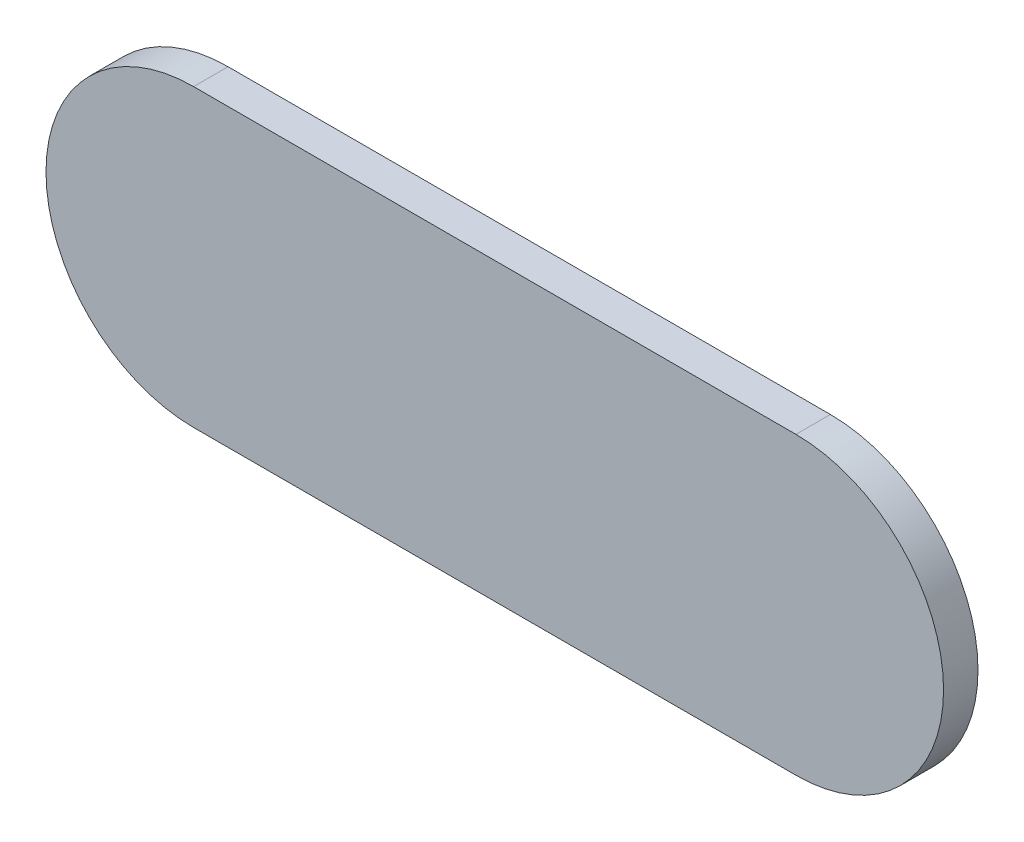
ISO-10303-21;
HEADER;
FILE_DESCRIPTION(('STEP AP214'),'2;1');
FILE_NAME('part.step','',(''),(''),'','','');
FILE_SCHEMA(('AUTOMOTIVE_DESIGN { 1 0 10303 214 1 1 1 1 }'));
ENDSEC;
DATA;
#1=APPLICATION_CONTEXT('core data for automotive mechanical design processes');
#2=APPLICATION_PROTOCOL_DEFINITION('international standard','automotive_design',2000,#1);
#3=PRODUCT_CONTEXT('',#1,'mechanical');
#4=PRODUCT('Part','Part','',(#3));
#5=PRODUCT_RELATED_PRODUCT_CATEGORY('part','',(#4));
#6=PRODUCT_DEFINITION_FORMATION('','',#4);
#7=PRODUCT_DEFINITION_CONTEXT('part definition',#1,'design');
#8=PRODUCT_DEFINITION('design','',#6,#7);
#9=PRODUCT_DEFINITION_SHAPE('','',#8);
#10=(LENGTH_UNIT() NAMED_UNIT(*) SI_UNIT(.MILLI.,.METRE.));
#11=(NAMED_UNIT(*) PLANE_ANGLE_UNIT() SI_UNIT($,.RADIAN.));
#12=(NAMED_UNIT(*) SI_UNIT($,.STERADIAN.) SOLID_ANGLE_UNIT());
#13=UNCERTAINTY_MEASURE_WITH_UNIT(LENGTH_MEASURE(1.E-05),#10,'distance_accuracy_value','');
#14=(GEOMETRIC_REPRESENTATION_CONTEXT(3) GLOBAL_UNCERTAINTY_ASSIGNED_CONTEXT((#13)) GLOBAL_UNIT_ASSIGNED_CONTEXT((#10,
#11,#12)) REPRESENTATION_CONTEXT('',''));
#15=CARTESIAN_POINT('',(0.,0.,0.));
#16=DIRECTION('',(0.,0.,1.));
#17=DIRECTION('',(1.,0.,0.));
#18=AXIS2_PLACEMENT_3D('',#15,#16,#17);
#19=CARTESIAN_POINT('',(120.055,-66.235,1.635));
#20=DIRECTION('',(0.,0.,1.));
#21=DIRECTION('',(1.,0.,0.));
#22=AXIS2_PLACEMENT_3D('',#19,#20,#21);
#23=PLANE('',#22);
#24=DIRECTION('',(-1.,0.,0.));
#25=VECTOR('',#24,1.);
#26=CARTESIAN_POINT('',(120.055,-66.235,1.635));
#27=LINE('',#26,#25);
#28=CARTESIAN_POINT('',(120.055,-66.235,1.635));
#29=VERTEX_POINT('',#28);
#30=CARTESIAN_POINT('',(119.443,-66.235,1.635));
#31=VERTEX_POINT('',#30);
#32=EDGE_CURVE('E81',#29,#31,#27,.T.);
#33=ORIENTED_EDGE('',*,*,#32,.T.);
#34=CARTESIAN_POINT('',(119.443,-66.385,1.635));
#35=DIRECTION('',(0.,0.,1.));
#36=DIRECTION('',(0.,1.,0.));
#37=AXIS2_PLACEMENT_3D('',#34,#35,#36);
#38=CIRCLE('',#37,0.15);
#39=CARTESIAN_POINT('',(119.443,-66.535,1.635));
#40=VERTEX_POINT('',#39);
#41=EDGE_CURVE('E99',#31,#40,#38,.T.);
#42=ORIENTED_EDGE('',*,*,#41,.T.);
#43=DIRECTION('',(1.,0.,0.));
#44=VECTOR('',#43,1.);
#45=CARTESIAN_POINT('',(119.443,-66.535,1.635));
#46=LINE('',#45,#44);
#47=CARTESIAN_POINT('',(120.055,-66.535,1.635));
#48=VERTEX_POINT('',#47);
#49=EDGE_CURVE('E74',#40,#48,#46,.T.);
#50=ORIENTED_EDGE('',*,*,#49,.T.);
#51=CARTESIAN_POINT('',(120.055,-66.385,1.635));
#52=DIRECTION('',(0.,0.,1.));
#53=DIRECTION('',(0.,-1.,0.));
#54=AXIS2_PLACEMENT_3D('',#51,#52,#53);
#55=CIRCLE('',#54,0.15);
#56=EDGE_CURVE('E11',#48,#29,#55,.T.);
#57=ORIENTED_EDGE('',*,*,#56,.T.);
#58=EDGE_LOOP('',(#33,#42,#50,#57));
#59=FACE_BOUND('',#58,.T.);
#60=ADVANCED_FACE('F17',(#59),#23,.T.);
#61=CARTESIAN_POINT('',(120.055,-66.235,1.6));
#62=DIRECTION('',(0.,0.,1.));
#63=DIRECTION('',(1.,0.,0.));
#64=AXIS2_PLACEMENT_3D('',#61,#62,#63);
#65=PLANE('',#64);
#66=CARTESIAN_POINT('',(120.055,-66.385,1.6));
#67=DIRECTION('',(0.,0.,1.));
#68=DIRECTION('',(0.,-1.,0.));
#69=AXIS2_PLACEMENT_3D('',#66,#67,#68);
#70=CIRCLE('',#69,0.15);
#71=CARTESIAN_POINT('',(120.055,-66.535,1.6));
#72=VERTEX_POINT('',#71);
#73=CARTESIAN_POINT('',(120.055,-66.235,1.6));
#74=VERTEX_POINT('',#73);
#75=EDGE_CURVE('E26',#72,#74,#70,.T.);
#76=ORIENTED_EDGE('',*,*,#75,.F.);
#77=DIRECTION('',(1.,0.,0.));
#78=VECTOR('',#77,1.);
#79=CARTESIAN_POINT('',(119.443,-66.535,1.6));
#80=LINE('',#79,#78);
#81=CARTESIAN_POINT('',(119.443,-66.535,1.6));
#82=VERTEX_POINT('',#81);
#83=EDGE_CURVE('E103',#82,#72,#80,.T.);
#84=ORIENTED_EDGE('',*,*,#83,.F.);
#85=CARTESIAN_POINT('',(119.443,-66.385,1.6));
#86=DIRECTION('',(0.,0.,1.));
#87=DIRECTION('',(0.,1.,0.));
#88=AXIS2_PLACEMENT_3D('',#85,#86,#87);
#89=CIRCLE('',#88,0.15);
#90=CARTESIAN_POINT('',(119.443,-66.235,1.6));
#91=VERTEX_POINT('',#90);
#92=EDGE_CURVE('E83',#91,#82,#89,.T.);
#93=ORIENTED_EDGE('',*,*,#92,.F.);
#94=DIRECTION('',(-1.,0.,0.));
#95=VECTOR('',#94,1.);
#96=CARTESIAN_POINT('',(120.055,-66.235,1.6));
#97=LINE('',#96,#95);
#98=EDGE_CURVE('E79',#74,#91,#97,.T.);
#99=ORIENTED_EDGE('',*,*,#98,.F.);
#100=EDGE_LOOP('',(#76,#84,#93,#99));
#101=FACE_BOUND('',#100,.T.);
#102=ADVANCED_FACE('F85',(#101),#65,.F.);
#103=CARTESIAN_POINT('',(120.055,-66.385,1.6));
#104=DIRECTION('',(0.,0.,-1.));
#105=DIRECTION('',(0.,-1.,0.));
#106=AXIS2_PLACEMENT_3D('',#103,#104,#105);
#107=CYLINDRICAL_SURFACE('',#106,0.15);
#108=ORIENTED_EDGE('',*,*,#75,.T.);
#109=DIRECTION('',(0.,0.,1.));
#110=VECTOR('',#109,1.);
#111=CARTESIAN_POINT('',(120.055,-66.235,1.6));
#112=LINE('',#111,#110);
#113=EDGE_CURVE('E68',#74,#29,#112,.T.);
#114=ORIENTED_EDGE('',*,*,#113,.T.);
#115=ORIENTED_EDGE('',*,*,#56,.F.);
#116=DIRECTION('',(0.,0.,1.));
#117=VECTOR('',#116,1.);
#118=CARTESIAN_POINT('',(120.055,-66.535,1.6));
#119=LINE('',#118,#117);
#120=EDGE_CURVE('E71',#72,#48,#119,.T.);
#121=ORIENTED_EDGE('',*,*,#120,.F.);
#122=EDGE_LOOP('',(#108,#114,#115,#121));
#123=FACE_BOUND('',#122,.T.);
#124=ADVANCED_FACE('F19',(#123),#107,.T.);
#125=CARTESIAN_POINT('',(119.443,-66.535,1.6));
#126=DIRECTION('',(0.,1.,0.));
#127=DIRECTION('',(1.,0.,0.));
#128=AXIS2_PLACEMENT_3D('',#125,#126,#127);
#129=PLANE('',#128);
#130=ORIENTED_EDGE('',*,*,#83,.T.);
#131=ORIENTED_EDGE('',*,*,#120,.T.);
#132=ORIENTED_EDGE('',*,*,#49,.F.);
#133=DIRECTION('',(0.,0.,1.));
#134=VECTOR('',#133,1.);
#135=CARTESIAN_POINT('',(119.443,-66.535,1.6));
#136=LINE('',#135,#134);
#137=EDGE_CURVE('E97',#82,#40,#136,.T.);
#138=ORIENTED_EDGE('',*,*,#137,.F.);
#139=EDGE_LOOP('',(#130,#131,#132,#138));
#140=FACE_BOUND('',#139,.T.);
#141=ADVANCED_FACE('F119',(#140),#129,.F.);
#142=CARTESIAN_POINT('',(119.443,-66.385,1.6));
#143=DIRECTION('',(0.,0.,-1.));
#144=DIRECTION('',(0.,1.,0.));
#145=AXIS2_PLACEMENT_3D('',#142,#143,#144);
#146=CYLINDRICAL_SURFACE('',#145,0.15);
#147=ORIENTED_EDGE('',*,*,#92,.T.);
#148=ORIENTED_EDGE('',*,*,#137,.T.);
#149=ORIENTED_EDGE('',*,*,#41,.F.);
#150=DIRECTION('',(0.,0.,1.));
#151=VECTOR('',#150,1.);
#152=CARTESIAN_POINT('',(119.443,-66.235,1.6));
#153=LINE('',#152,#151);
#154=EDGE_CURVE('E89',#91,#31,#153,.T.);
#155=ORIENTED_EDGE('',*,*,#154,.F.);
#156=EDGE_LOOP('',(#147,#148,#149,#155));
#157=FACE_BOUND('',#156,.T.);
#158=ADVANCED_FACE('F122',(#157),#146,.T.);
#159=CARTESIAN_POINT('',(120.055,-66.235,1.6));
#160=DIRECTION('',(0.,-1.,0.));
#161=DIRECTION('',(0.,0.,-1.));
#162=AXIS2_PLACEMENT_3D('',#159,#160,#161);
#163=PLANE('',#162);
#164=ORIENTED_EDGE('',*,*,#98,.T.);
#165=ORIENTED_EDGE('',*,*,#154,.T.);
#166=ORIENTED_EDGE('',*,*,#32,.F.);
#167=ORIENTED_EDGE('',*,*,#113,.F.);
#168=EDGE_LOOP('',(#164,#165,#166,#167));
#169=FACE_BOUND('',#168,.T.);
#170=ADVANCED_FACE('F77',(#169),#163,.F.);
#171=CLOSED_SHELL('',(#60,#102,#124,#141,#158,#170));
#172=MANIFOLD_SOLID_BREP('B1',#171);
#173=ADVANCED_BREP_SHAPE_REPRESENTATION('',(#18,#172),#14);
#174=SHAPE_DEFINITION_REPRESENTATION(#9,#173);
ENDSEC;
END-ISO-10303-21;
